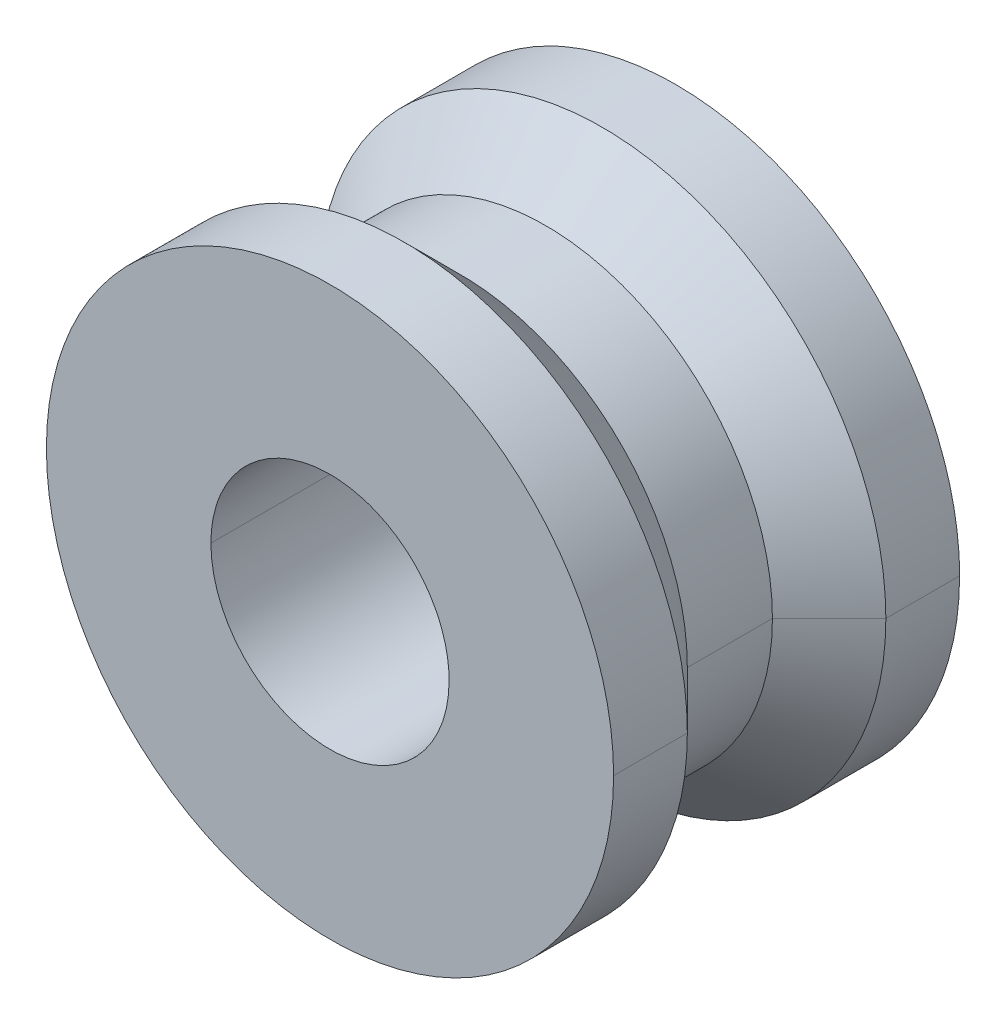
ISO-10303-21;
HEADER;
FILE_DESCRIPTION(('STEP AP214'),'2;1');
FILE_NAME('part.step','',(''),(''),'','','');
FILE_SCHEMA(('AUTOMOTIVE_DESIGN { 1 0 10303 214 1 1 1 1 }'));
ENDSEC;
DATA;
#1=APPLICATION_CONTEXT('core data for automotive mechanical design processes');
#2=APPLICATION_PROTOCOL_DEFINITION('international standard','automotive_design',2000,#1);
#3=PRODUCT_CONTEXT('',#1,'mechanical');
#4=PRODUCT('Part','Part','',(#3));
#5=PRODUCT_RELATED_PRODUCT_CATEGORY('part','',(#4));
#6=PRODUCT_DEFINITION_FORMATION('','',#4);
#7=PRODUCT_DEFINITION_CONTEXT('part definition',#1,'design');
#8=PRODUCT_DEFINITION('design','',#6,#7);
#9=PRODUCT_DEFINITION_SHAPE('','',#8);
#10=(LENGTH_UNIT() NAMED_UNIT(*) SI_UNIT(.MILLI.,.METRE.));
#11=(NAMED_UNIT(*) PLANE_ANGLE_UNIT() SI_UNIT($,.RADIAN.));
#12=(NAMED_UNIT(*) SI_UNIT($,.STERADIAN.) SOLID_ANGLE_UNIT());
#13=UNCERTAINTY_MEASURE_WITH_UNIT(LENGTH_MEASURE(1.E-05),#10,'distance_accuracy_value','');
#14=(GEOMETRIC_REPRESENTATION_CONTEXT(3) GLOBAL_UNCERTAINTY_ASSIGNED_CONTEXT((#13)) GLOBAL_UNIT_ASSIGNED_CONTEXT((#10,
#11,#12)) REPRESENTATION_CONTEXT('',''));
#15=CARTESIAN_POINT('',(0.,0.,0.));
#16=DIRECTION('',(0.,0.,1.));
#17=DIRECTION('',(1.,0.,0.));
#18=AXIS2_PLACEMENT_3D('',#15,#16,#17);
#19=CARTESIAN_POINT('',(0.,0.,6.1));
#20=DIRECTION('',(0.,0.,1.));
#21=DIRECTION('',(-1.,0.,0.));
#22=AXIS2_PLACEMENT_3D('',#19,#20,#21);
#23=CYLINDRICAL_SURFACE('',#22,5.);
#24=DIRECTION('',(0.,0.,-1.));
#25=VECTOR('',#24,1.);
#26=CARTESIAN_POINT('',(-5.,0.,6.09999999963));
#27=LINE('',#26,#25);
#28=CARTESIAN_POINT('',(-5.,0.,1.29999999925));
#29=VERTEX_POINT('',#28);
#30=CARTESIAN_POINT('',(-5.,0.,3.72528674575E-10));
#31=VERTEX_POINT('',#30);
#32=EDGE_CURVE('E11',#29,#31,#27,.T.);
#33=ORIENTED_EDGE('',*,*,#32,.T.);
#34=CARTESIAN_POINT('',(0.,0.,3.72528674575E-10));
#35=DIRECTION('',(0.,0.,-1.));
#36=DIRECTION('',(1.,0.,0.));
#37=AXIS2_PLACEMENT_3D('',#34,#35,#36);
#38=CIRCLE('',#37,5.);
#39=CARTESIAN_POINT('',(5.,0.,3.72528674575E-10));
#40=VERTEX_POINT('',#39);
#41=EDGE_CURVE('E42',#40,#31,#38,.T.);
#42=ORIENTED_EDGE('',*,*,#41,.F.);
#43=DIRECTION('',(0.,0.,1.));
#44=VECTOR('',#43,1.);
#45=CARTESIAN_POINT('',(5.,0.,6.09999999963));
#46=LINE('',#45,#44);
#47=CARTESIAN_POINT('',(5.,0.,1.29999999925));
#48=VERTEX_POINT('',#47);
#49=EDGE_CURVE('E29',#40,#48,#46,.T.);
#50=ORIENTED_EDGE('',*,*,#49,.T.);
#51=CARTESIAN_POINT('',(0.,0.,1.29999999925));
#52=DIRECTION('',(0.,0.,1.));
#53=DIRECTION('',(1.,0.,0.));
#54=AXIS2_PLACEMENT_3D('',#51,#52,#53);
#55=CIRCLE('',#54,5.);
#56=EDGE_CURVE('E281',#29,#48,#55,.T.);
#57=ORIENTED_EDGE('',*,*,#56,.F.);
#58=EDGE_LOOP('',(#33,#42,#50,#57));
#59=FACE_BOUND('',#58,.T.);
#60=ADVANCED_FACE('F17',(#59),#23,.T.);
#61=CARTESIAN_POINT('',(0.,0.,6.1));
#62=DIRECTION('',(0.,0.,1.));
#63=DIRECTION('',(1.,0.,0.));
#64=AXIS2_PLACEMENT_3D('',#61,#62,#63);
#65=CYLINDRICAL_SURFACE('',#64,5.);
#66=ORIENTED_EDGE('',*,*,#49,.F.);
#67=CARTESIAN_POINT('',(-5.,0.,0.));
#68=CARTESIAN_POINT('',(-5.,0.492186498983224,0.));
#69=CARTESIAN_POINT('',(-4.90391644950907,0.975447811562946,0.));
#70=CARTESIAN_POINT('',(-4.80799305653689,1.45790359674146,0.));
#71=CARTESIAN_POINT('',(-4.61937432680324,1.9134074958401,0.));
#72=CARTESIAN_POINT('',(-4.43116551586412,2.36792146350678,0.));
#73=CARTESIAN_POINT('',(-4.15733833806703,2.77784681357007,0.));
#74=CARTESIAN_POINT('',(-3.88409505945526,3.18689805362034,0.));
#75=CARTESIAN_POINT('',(-3.53553390592788,3.53553390593212,0.));
#76=CARTESIAN_POINT('',(-3.18773020719626,3.88341214112095,0.));
#77=CARTESIAN_POINT('',(-2.77784681356514,4.15733833807007,0.));
#78=CARTESIAN_POINT('',(-2.3688709745934,4.43065801374942,0.));
#79=CARTESIAN_POINT('',(-1.91340749583552,4.61937432680489,0.));
#80=CARTESIAN_POINT('',(-1.4589338606613,4.80768050899296,0.));
#81=CARTESIAN_POINT('',(-0.97544781155973,4.90391644950954,0.));
#82=CARTESIAN_POINT('',(-0.492992730649619,4.99994717998183,0.));
#83=CARTESIAN_POINT('',(0.,5.,0.));
#84=CARTESIAN_POINT('',(0.491921413016036,5.00005270523551,0.));
#85=CARTESIAN_POINT('',(0.97544781155973,4.90391644950954,0.));
#86=CARTESIAN_POINT('',(1.4579035967431,4.80799305653544,0.));
#87=CARTESIAN_POINT('',(1.91340749583552,4.61937432680489,0.));
#88=CARTESIAN_POINT('',(2.36792146350213,4.43116551586632,0.));
#89=CARTESIAN_POINT('',(2.77784681356514,4.15733833807007,0.));
#90=CARTESIAN_POINT('',(3.18689805361369,3.88409505946012,0.));
#91=CARTESIAN_POINT('',(3.53553390592788,3.53553390593212,0.));
#92=CARTESIAN_POINT('',(3.88341214111206,3.18773020720694,0.));
#93=CARTESIAN_POINT('',(4.15733833806703,2.77784681357007,0.));
#94=CARTESIAN_POINT('',(4.43065801374484,2.36887097460359,0.));
#95=CARTESIAN_POINT('',(4.61937432680324,1.9134074958401,0.));
#96=CARTESIAN_POINT('',(4.80768050898876,1.45893386067351,0.));
#97=CARTESIAN_POINT('',(4.90391644950907,0.975447811562946,0.));
#98=CARTESIAN_POINT('',(5.,0.492727364709029,0.));
#99=CARTESIAN_POINT('',(5.,0.,0.));
#100=B_SPLINE_CURVE_WITH_KNOTS('',2,(#67,#68,#69,#70,#71,#72,#73,#74,#75,#76,#77,#78,#79,#80,
#81,#82,#83,#84,#85,#86,#87,#88,#89,#90,#91,#92,#93,#94,#95,#96,#97,#98,#99),.UNSPECIFIED.,.F.,
.F.,(3,2,2,2,2,2,2,2,2,2,2,2,2,2,2,2,3),(0.,0.0625,0.125,0.1875,0.25,0.3125,0.375,0.4375,0.5,
0.5625,0.625,0.6875,0.75,0.8125,0.875,0.9375,1.),.UNSPECIFIED.);
#101=EDGE_CURVE('E245',#31,#40,#100,.T.);
#102=ORIENTED_EDGE('',*,*,#101,.F.);
#103=ORIENTED_EDGE('',*,*,#32,.F.);
#104=CARTESIAN_POINT('',(0.,0.,1.3));
#105=DIRECTION('',(0.,0.,1.));
#106=DIRECTION('',(1.,0.,0.));
#107=AXIS2_PLACEMENT_3D('',#104,#105,#106);
#108=CIRCLE('',#107,5.);
#109=EDGE_CURVE('E134',#48,#29,#108,.T.);
#110=ORIENTED_EDGE('',*,*,#109,.F.);
#111=EDGE_LOOP('',(#66,#102,#103,#110));
#112=FACE_BOUND('',#111,.T.);
#113=ADVANCED_FACE('F187',(#112),#65,.T.);
#114=CARTESIAN_POINT('',(0.,0.,0.));
#115=DIRECTION('',(0.,0.,-1.));
#116=DIRECTION('',(0.,-1.,0.));
#117=AXIS2_PLACEMENT_3D('',#114,#115,#116);
#118=PLANE('',#117);
#119=ORIENTED_EDGE('',*,*,#41,.T.);
#120=ORIENTED_EDGE('',*,*,#101,.T.);
#121=EDGE_LOOP('',(#119,#120));
#122=FACE_BOUND('',#121,.T.);
#123=CARTESIAN_POINT('',(0.,0.,0.));
#124=DIRECTION('',(0.,0.,1.));
#125=DIRECTION('',(1.,0.,0.));
#126=AXIS2_PLACEMENT_3D('',#123,#124,#125);
#127=CIRCLE('',#126,2.09999999963);
#128=CARTESIAN_POINT('',(2.09999999963,0.,0.));
#129=VERTEX_POINT('',#128);
#130=CARTESIAN_POINT('',(-2.09999999963,0.,0.));
#131=VERTEX_POINT('',#130);
#132=EDGE_CURVE('E131',#129,#131,#127,.T.);
#133=ORIENTED_EDGE('',*,*,#132,.T.);
#134=CARTESIAN_POINT('',(0.,0.,0.));
#135=DIRECTION('',(0.,0.,1.));
#136=DIRECTION('',(1.,0.,0.));
#137=AXIS2_PLACEMENT_3D('',#134,#135,#136);
#138=CIRCLE('',#137,2.09999999963);
#139=EDGE_CURVE('E58',#131,#129,#138,.T.);
#140=ORIENTED_EDGE('',*,*,#139,.T.);
#141=EDGE_LOOP('',(#133,#140));
#142=FACE_BOUND('',#141,.T.);
#143=ADVANCED_FACE('F193',(#122,#142),#118,.T.);
#144=CARTESIAN_POINT('',(0.,0.,1.3));
#145=DIRECTION('',(0.,0.,-1.));
#146=DIRECTION('',(1.,0.,0.));
#147=AXIS2_PLACEMENT_3D('',#144,#145,#146);
#148=CONICAL_SURFACE('',#147,5.,0.785398163397);
#149=DIRECTION('',(0.707106781186548,0.,-0.707106781186548));
#150=VECTOR('',#149,1.);
#151=CARTESIAN_POINT('',(353555.890593,4.32981089735E-11,-353549.590593));
#152=LINE('',#151,#150);
#153=CARTESIAN_POINT('',(4.,0.,2.3));
#154=VERTEX_POINT('',#153);
#155=EDGE_CURVE('E292',#154,#48,#152,.T.);
#156=ORIENTED_EDGE('',*,*,#155,.F.);
#157=CARTESIAN_POINT('',(0.,0.,2.3));
#158=DIRECTION('',(0.,0.,1.));
#159=DIRECTION('',(1.,0.,0.));
#160=AXIS2_PLACEMENT_3D('',#157,#158,#159);
#161=CIRCLE('',#160,4.);
#162=CARTESIAN_POINT('',(-4.,0.,2.3));
#163=VERTEX_POINT('',#162);
#164=EDGE_CURVE('E144',#163,#154,#161,.T.);
#165=ORIENTED_EDGE('',*,*,#164,.F.);
#166=DIRECTION('',(0.707106781186548,0.,0.707106781186548));
#167=VECTOR('',#166,1.);
#168=CARTESIAN_POINT('',(-353555.890593,-8.65962179469E-11,-353549.590593));
#169=LINE('',#168,#167);
#170=EDGE_CURVE('E289',#29,#163,#169,.T.);
#171=ORIENTED_EDGE('',*,*,#170,.F.);
#172=ORIENTED_EDGE('',*,*,#56,.T.);
#173=EDGE_LOOP('',(#156,#165,#171,#172));
#174=FACE_BOUND('',#173,.T.);
#175=ADVANCED_FACE('F197',(#174),#148,.T.);
#176=CARTESIAN_POINT('',(0.,0.,1.3));
#177=DIRECTION('',(0.,0.,-1.));
#178=DIRECTION('',(-1.,0.,0.));
#179=AXIS2_PLACEMENT_3D('',#176,#177,#178);
#180=CONICAL_SURFACE('',#179,5.,0.785398163397);
#181=ORIENTED_EDGE('',*,*,#170,.T.);
#182=CARTESIAN_POINT('',(0.,0.,2.3));
#183=DIRECTION('',(0.,0.,1.));
#184=DIRECTION('',(1.,0.,0.));
#185=AXIS2_PLACEMENT_3D('',#182,#183,#184);
#186=CIRCLE('',#185,4.);
#187=EDGE_CURVE('E74',#154,#163,#186,.T.);
#188=ORIENTED_EDGE('',*,*,#187,.F.);
#189=ORIENTED_EDGE('',*,*,#155,.T.);
#190=ORIENTED_EDGE('',*,*,#109,.T.);
#191=EDGE_LOOP('',(#181,#188,#189,#190));
#192=FACE_BOUND('',#191,.T.);
#193=ADVANCED_FACE('F200',(#192),#180,.T.);
#194=CARTESIAN_POINT('',(0.,0.,-23.4969402864));
#195=DIRECTION('',(0.,0.,-1.));
#196=DIRECTION('',(-1.,0.,0.));
#197=AXIS2_PLACEMENT_3D('',#194,#195,#196);
#198=CYLINDRICAL_SURFACE('',#197,2.1);
#199=ORIENTED_EDGE('',*,*,#132,.F.);
#200=DIRECTION('',(0.,0.,1.));
#201=VECTOR('',#200,1.);
#202=CARTESIAN_POINT('',(2.1,0.,-23.4969402868));
#203=LINE('',#202,#201);
#204=CARTESIAN_POINT('',(2.1,0.,6.10000000004));
#205=VERTEX_POINT('',#204);
#206=EDGE_CURVE('E129',#129,#205,#203,.T.);
#207=ORIENTED_EDGE('',*,*,#206,.T.);
#208=CARTESIAN_POINT('',(-2.1,0.,6.1));
#209=CARTESIAN_POINT('',(-2.1,0.417441871031222,6.1));
#210=CARTESIAN_POINT('',(-1.93993886520666,0.803449337605341,6.1));
#211=CARTESIAN_POINT('',(-1.78028326079746,1.1884788168848,6.1));
#212=CARTESIAN_POINT('',(-1.48445594612734,1.48445594612719,6.1));
#213=CARTESIAN_POINT('',(-1.18938282284056,1.7796785020443,6.1));
#214=CARTESIAN_POINT('',(-0.803449337605737,1.93993886520665,6.1));
#215=CARTESIAN_POINT('',(-0.418251380334769,2.09989379755486,6.1));
#216=CARTESIAN_POINT('',(0.,2.1,6.1));
#217=CARTESIAN_POINT('',(0.417186402688448,2.10010593202589,6.1));
#218=CARTESIAN_POINT('',(0.803449337605737,1.93993886520665,6.1));
#219=CARTESIAN_POINT('',(1.18847881688427,1.78028326079774,6.1));
#220=CARTESIAN_POINT('',(1.48445594612734,1.48445594612719,6.1));
#221=CARTESIAN_POINT('',(1.77967850204349,1.18938282284162,6.1));
#222=CARTESIAN_POINT('',(1.93993886520666,0.803449337605342,6.1));
#223=CARTESIAN_POINT('',(2.1,0.417995627265443,6.1));
#224=CARTESIAN_POINT('',(2.1,0.,6.1));
#225=B_SPLINE_CURVE_WITH_KNOTS('',2,(#208,#209,#210,#211,#212,#213,#214,#215,#216,#217,#218,
#219,#220,#221,#222,#223,#224),.UNSPECIFIED.,.F.,.F.,(3,2,2,2,2,2,2,2,3),(0.,0.125,0.25,0.375,
0.5,0.625,0.75,0.875,1.),.UNSPECIFIED.);
#226=CARTESIAN_POINT('',(-2.1,0.,6.10000000004));
#227=VERTEX_POINT('',#226);
#228=EDGE_CURVE('E114',#227,#205,#225,.T.);
#229=ORIENTED_EDGE('',*,*,#228,.F.);
#230=DIRECTION('',(0.,0.,-1.));
#231=VECTOR('',#230,1.);
#232=CARTESIAN_POINT('',(-2.1,0.,-23.4969402868));
#233=LINE('',#232,#231);
#234=EDGE_CURVE('E135',#227,#131,#233,.T.);
#235=ORIENTED_EDGE('',*,*,#234,.T.);
#236=EDGE_LOOP('',(#199,#207,#229,#235));
#237=FACE_BOUND('',#236,.T.);
#238=ADVANCED_FACE('F130',(#237),#198,.F.);
#239=CARTESIAN_POINT('',(0.,0.,-23.4969402864));
#240=DIRECTION('',(0.,0.,-1.));
#241=DIRECTION('',(1.,0.,0.));
#242=AXIS2_PLACEMENT_3D('',#239,#240,#241);
#243=CYLINDRICAL_SURFACE('',#242,2.1);
#244=ORIENTED_EDGE('',*,*,#139,.F.);
#245=ORIENTED_EDGE('',*,*,#234,.F.);
#246=CARTESIAN_POINT('',(0.,0.,6.10000000004));
#247=DIRECTION('',(0.,0.,-1.));
#248=DIRECTION('',(1.,0.,0.));
#249=AXIS2_PLACEMENT_3D('',#246,#247,#248);
#250=CIRCLE('',#249,2.1);
#251=EDGE_CURVE('E119',#205,#227,#250,.T.);
#252=ORIENTED_EDGE('',*,*,#251,.F.);
#253=ORIENTED_EDGE('',*,*,#206,.F.);
#254=EDGE_LOOP('',(#244,#245,#252,#253));
#255=FACE_BOUND('',#254,.T.);
#256=ADVANCED_FACE('F137',(#255),#243,.F.);
#257=CARTESIAN_POINT('',(0.,0.,0.));
#258=DIRECTION('',(0.,0.,-1.));
#259=DIRECTION('',(1.,0.,0.));
#260=AXIS2_PLACEMENT_3D('',#257,#258,#259);
#261=CYLINDRICAL_SURFACE('',#260,4.);
#262=DIRECTION('',(0.,0.,1.));
#263=VECTOR('',#262,1.);
#264=CARTESIAN_POINT('',(4.,0.,0.));
#265=LINE('',#264,#263);
#266=CARTESIAN_POINT('',(4.,0.,3.80000000075));
#267=VERTEX_POINT('',#266);
#268=EDGE_CURVE('E314',#154,#267,#265,.T.);
#269=ORIENTED_EDGE('',*,*,#268,.T.);
#270=CARTESIAN_POINT('',(0.,0.,3.80000000075));
#271=DIRECTION('',(0.,0.,1.));
#272=DIRECTION('',(1.,0.,0.));
#273=AXIS2_PLACEMENT_3D('',#270,#271,#272);
#274=CIRCLE('',#273,4.);
#275=CARTESIAN_POINT('',(-4.,0.,3.80000000075));
#276=VERTEX_POINT('',#275);
#277=EDGE_CURVE('E125',#276,#267,#274,.T.);
#278=ORIENTED_EDGE('',*,*,#277,.F.);
#279=DIRECTION('',(0.,0.,-1.));
#280=VECTOR('',#279,1.);
#281=CARTESIAN_POINT('',(-4.,0.,0.));
#282=LINE('',#281,#280);
#283=EDGE_CURVE('E307',#276,#163,#282,.T.);
#284=ORIENTED_EDGE('',*,*,#283,.T.);
#285=ORIENTED_EDGE('',*,*,#164,.T.);
#286=EDGE_LOOP('',(#269,#278,#284,#285));
#287=FACE_BOUND('',#286,.T.);
#288=ADVANCED_FACE('F204',(#287),#261,.T.);
#289=CARTESIAN_POINT('',(0.,0.,0.));
#290=DIRECTION('',(0.,0.,-1.));
#291=DIRECTION('',(-1.,0.,0.));
#292=AXIS2_PLACEMENT_3D('',#289,#290,#291);
#293=CYLINDRICAL_SURFACE('',#292,4.);
#294=ORIENTED_EDGE('',*,*,#283,.F.);
#295=CARTESIAN_POINT('',(0.,0.,3.800000000375));
#296=DIRECTION('',(0.,0.,1.));
#297=DIRECTION('',(1.,0.,0.));
#298=AXIS2_PLACEMENT_3D('',#295,#296,#297);
#299=CIRCLE('',#298,4.000000000375);
#300=EDGE_CURVE('E159',#267,#276,#299,.T.);
#301=ORIENTED_EDGE('',*,*,#300,.F.);
#302=ORIENTED_EDGE('',*,*,#268,.F.);
#303=ORIENTED_EDGE('',*,*,#187,.T.);
#304=EDGE_LOOP('',(#294,#301,#302,#303));
#305=FACE_BOUND('',#304,.T.);
#306=ADVANCED_FACE('F19',(#305),#293,.T.);
#307=CARTESIAN_POINT('',(0.,0.,6.1));
#308=DIRECTION('',(0.,0.,-1.));
#309=DIRECTION('',(0.,-1.,0.));
#310=AXIS2_PLACEMENT_3D('',#307,#308,#309);
#311=PLANE('',#310);
#312=CARTESIAN_POINT('',(0.,0.,6.1));
#313=DIRECTION('',(0.,0.,-1.));
#314=DIRECTION('',(1.,0.,0.));
#315=AXIS2_PLACEMENT_3D('',#312,#313,#314);
#316=CIRCLE('',#315,5.);
#317=CARTESIAN_POINT('',(-5.,0.,6.1));
#318=VERTEX_POINT('',#317);
#319=CARTESIAN_POINT('',(5.,0.,6.1));
#320=VERTEX_POINT('',#319);
#321=EDGE_CURVE('E328',#318,#320,#316,.T.);
#322=ORIENTED_EDGE('',*,*,#321,.F.);
#323=CARTESIAN_POINT('',(0.,0.,6.1));
#324=DIRECTION('',(0.,0.,-1.));
#325=DIRECTION('',(1.,0.,0.));
#326=AXIS2_PLACEMENT_3D('',#323,#324,#325);
#327=CIRCLE('',#326,5.);
#328=EDGE_CURVE('E88',#320,#318,#327,.T.);
#329=ORIENTED_EDGE('',*,*,#328,.F.);
#330=EDGE_LOOP('',(#322,#329));
#331=FACE_BOUND('',#330,.T.);
#332=ORIENTED_EDGE('',*,*,#251,.T.);
#333=ORIENTED_EDGE('',*,*,#228,.T.);
#334=EDGE_LOOP('',(#332,#333));
#335=FACE_BOUND('',#334,.T.);
#336=ADVANCED_FACE('F117',(#331,#335),#311,.F.);
#337=CARTESIAN_POINT('',(0.,0.,3.8));
#338=DIRECTION('',(0.,0.,1.));
#339=DIRECTION('',(-1.,0.,0.));
#340=AXIS2_PLACEMENT_3D('',#337,#338,#339);
#341=CONICAL_SURFACE('',#340,4.,0.785398163397);
#342=DIRECTION('',(-0.707106781186548,0.,0.707106781186548));
#343=VECTOR('',#342,1.);
#344=CARTESIAN_POINT('',(-353555.390593,4.32980477411E-11,353555.190593));
#345=LINE('',#344,#343);
#346=CARTESIAN_POINT('',(-5.,0.,4.8));
#347=VERTEX_POINT('',#346);
#348=EDGE_CURVE('E326',#276,#347,#345,.T.);
#349=ORIENTED_EDGE('',*,*,#348,.F.);
#350=ORIENTED_EDGE('',*,*,#277,.T.);
#351=DIRECTION('',(-0.707106781186548,0.,-0.707106781186548));
#352=VECTOR('',#351,1.);
#353=CARTESIAN_POINT('',(353555.390593,-8.65960954823E-11,353555.190593));
#354=LINE('',#353,#352);
#355=CARTESIAN_POINT('',(5.,0.,4.8));
#356=VERTEX_POINT('',#355);
#357=EDGE_CURVE('E332',#356,#267,#354,.T.);
#358=ORIENTED_EDGE('',*,*,#357,.F.);
#359=CARTESIAN_POINT('',(0.,0.,4.8));
#360=DIRECTION('',(0.,0.,1.));
#361=DIRECTION('',(1.,0.,0.));
#362=AXIS2_PLACEMENT_3D('',#359,#360,#361);
#363=CIRCLE('',#362,5.);
#364=EDGE_CURVE('E350',#347,#356,#363,.T.);
#365=ORIENTED_EDGE('',*,*,#364,.F.);
#366=EDGE_LOOP('',(#349,#350,#358,#365));
#367=FACE_BOUND('',#366,.T.);
#368=ADVANCED_FACE('F177',(#367),#341,.T.);
#369=CARTESIAN_POINT('',(0.,0.,3.8));
#370=DIRECTION('',(0.,0.,1.));
#371=DIRECTION('',(1.,0.,0.));
#372=AXIS2_PLACEMENT_3D('',#369,#370,#371);
#373=CONICAL_SURFACE('',#372,4.,0.785398163397);
#374=ORIENTED_EDGE('',*,*,#357,.T.);
#375=ORIENTED_EDGE('',*,*,#300,.T.);
#376=ORIENTED_EDGE('',*,*,#348,.T.);
#377=CARTESIAN_POINT('',(0.,0.,4.8));
#378=DIRECTION('',(0.,0.,1.));
#379=DIRECTION('',(1.,0.,0.));
#380=AXIS2_PLACEMENT_3D('',#377,#378,#379);
#381=CIRCLE('',#380,5.);
#382=EDGE_CURVE('E334',#356,#347,#381,.T.);
#383=ORIENTED_EDGE('',*,*,#382,.F.);
#384=EDGE_LOOP('',(#374,#375,#376,#383));
#385=FACE_BOUND('',#384,.T.);
#386=ADVANCED_FACE('F166',(#385),#373,.T.);
#387=CARTESIAN_POINT('',(0.,0.,6.1));
#388=DIRECTION('',(0.,0.,1.));
#389=DIRECTION('',(1.,0.,0.));
#390=AXIS2_PLACEMENT_3D('',#387,#388,#389);
#391=CYLINDRICAL_SURFACE('',#390,5.);
#392=DIRECTION('',(0.,0.,-1.));
#393=VECTOR('',#392,1.);
#394=CARTESIAN_POINT('',(-5.,0.,6.09999999963));
#395=LINE('',#394,#393);
#396=EDGE_CURVE('E349',#318,#347,#395,.T.);
#397=ORIENTED_EDGE('',*,*,#396,.F.);
#398=ORIENTED_EDGE('',*,*,#321,.T.);
#399=DIRECTION('',(0.,0.,1.));
#400=VECTOR('',#399,1.);
#401=CARTESIAN_POINT('',(5.,0.,6.09999999963));
#402=LINE('',#401,#400);
#403=EDGE_CURVE('E341',#356,#320,#402,.T.);
#404=ORIENTED_EDGE('',*,*,#403,.F.);
#405=ORIENTED_EDGE('',*,*,#382,.T.);
#406=EDGE_LOOP('',(#397,#398,#404,#405));
#407=FACE_BOUND('',#406,.T.);
#408=ADVANCED_FACE('F176',(#407),#391,.T.);
#409=CARTESIAN_POINT('',(0.,0.,6.1));
#410=DIRECTION('',(0.,0.,1.));
#411=DIRECTION('',(-1.,0.,0.));
#412=AXIS2_PLACEMENT_3D('',#409,#410,#411);
#413=CYLINDRICAL_SURFACE('',#412,5.);
#414=ORIENTED_EDGE('',*,*,#403,.T.);
#415=ORIENTED_EDGE('',*,*,#328,.T.);
#416=ORIENTED_EDGE('',*,*,#396,.T.);
#417=ORIENTED_EDGE('',*,*,#364,.T.);
#418=EDGE_LOOP('',(#414,#415,#416,#417));
#419=FACE_BOUND('',#418,.T.);
#420=ADVANCED_FACE('F180',(#419),#413,.T.);
#421=CLOSED_SHELL('',(#60,#113,#143,#175,#193,#238,#256,#288,#306,#336,#368,#386,#408,#420));
#422=MANIFOLD_SOLID_BREP('B1',#421);
#423=ADVANCED_BREP_SHAPE_REPRESENTATION('',(#18,#422),#14);
#424=SHAPE_DEFINITION_REPRESENTATION(#9,#423);
ENDSEC;
END-ISO-10303-21;
